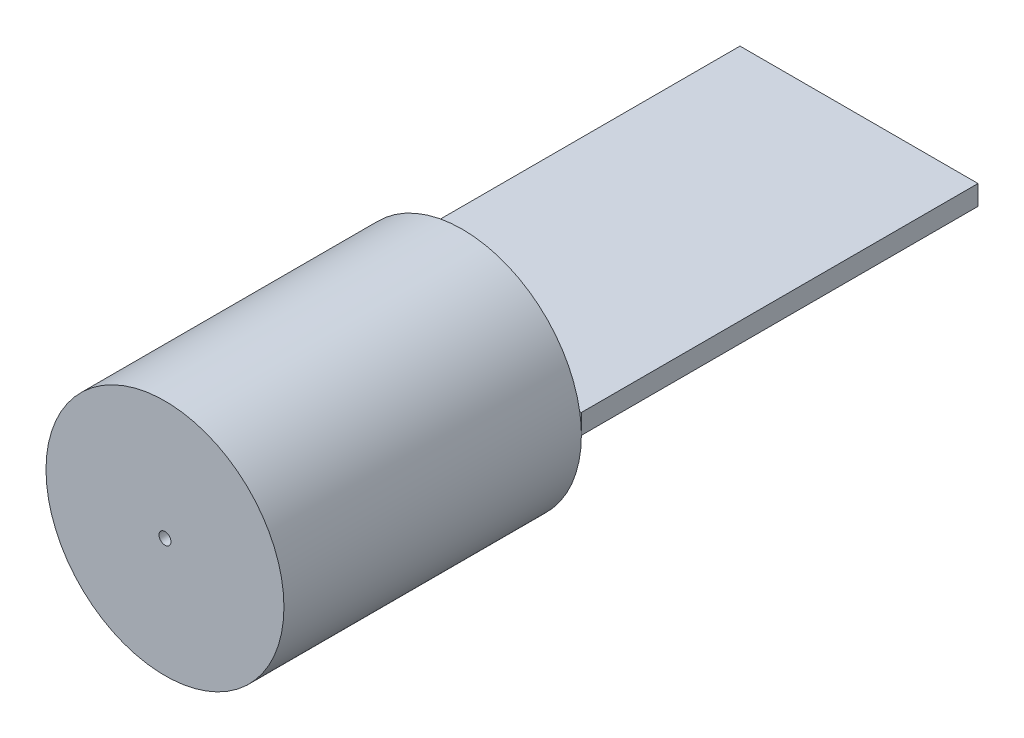
ISO-10303-21;
HEADER;
FILE_DESCRIPTION(('STEP AP214'),'2;1');
FILE_NAME('part.step','',(''),(''),'','','');
FILE_SCHEMA(('AUTOMOTIVE_DESIGN { 1 0 10303 214 1 1 1 1 }'));
ENDSEC;
DATA;
#1=APPLICATION_CONTEXT('core data for automotive mechanical design processes');
#2=APPLICATION_PROTOCOL_DEFINITION('international standard','automotive_design',2000,#1);
#3=PRODUCT_CONTEXT('',#1,'mechanical');
#4=PRODUCT('Part','Part','',(#3));
#5=PRODUCT_RELATED_PRODUCT_CATEGORY('part','',(#4));
#6=PRODUCT_DEFINITION_FORMATION('','',#4);
#7=PRODUCT_DEFINITION_CONTEXT('part definition',#1,'design');
#8=PRODUCT_DEFINITION('design','',#6,#7);
#9=PRODUCT_DEFINITION_SHAPE('','',#8);
#10=(LENGTH_UNIT() NAMED_UNIT(*) SI_UNIT(.MILLI.,.METRE.));
#11=(NAMED_UNIT(*) PLANE_ANGLE_UNIT() SI_UNIT($,.RADIAN.));
#12=(NAMED_UNIT(*) SI_UNIT($,.STERADIAN.) SOLID_ANGLE_UNIT());
#13=UNCERTAINTY_MEASURE_WITH_UNIT(LENGTH_MEASURE(1.E-05),#10,'distance_accuracy_value','');
#14=(GEOMETRIC_REPRESENTATION_CONTEXT(3) GLOBAL_UNCERTAINTY_ASSIGNED_CONTEXT((#13)) GLOBAL_UNIT_ASSIGNED_CONTEXT((#10,
#11,#12)) REPRESENTATION_CONTEXT('',''));
#15=CARTESIAN_POINT('',(0.,0.,0.));
#16=DIRECTION('',(0.,0.,1.));
#17=DIRECTION('',(1.,0.,0.));
#18=AXIS2_PLACEMENT_3D('',#15,#16,#17);
#19=CARTESIAN_POINT('',(0.,0.,0.));
#20=DIRECTION('',(0.,0.,1.));
#21=DIRECTION('',(1.,0.,0.));
#22=AXIS2_PLACEMENT_3D('',#19,#20,#21);
#23=PLANE('',#22);
#24=DIRECTION('',(1.,0.,0.));
#25=VECTOR('',#24,1.);
#26=CARTESIAN_POINT('',(-6.,1.,0.));
#27=LINE('',#26,#25);
#28=CARTESIAN_POINT('',(-5.91607978309962,1.,0.));
#29=VERTEX_POINT('',#28);
#30=CARTESIAN_POINT('',(5.91607978309962,1.,0.));
#31=VERTEX_POINT('',#30);
#32=EDGE_CURVE('E11',#29,#31,#27,.T.);
#33=ORIENTED_EDGE('',*,*,#32,.F.);
#34=CARTESIAN_POINT('',(0.,0.,0.));
#35=DIRECTION('',(0.,0.,1.));
#36=DIRECTION('',(1.,0.,0.));
#37=AXIS2_PLACEMENT_3D('',#34,#35,#36);
#38=CIRCLE('',#37,6.);
#39=EDGE_CURVE('E138',#31,#29,#38,.T.);
#40=ORIENTED_EDGE('',*,*,#39,.F.);
#41=EDGE_LOOP('',(#33,#40));
#42=FACE_BOUND('',#41,.T.);
#43=ADVANCED_FACE('F39',(#42),#23,.F.);
#44=CARTESIAN_POINT('',(0.,0.,15.));
#45=DIRECTION('',(0.,0.,-1.));
#46=DIRECTION('',(-1.,0.,0.));
#47=AXIS2_PLACEMENT_3D('',#44,#45,#46);
#48=CYLINDRICAL_SURFACE('',#47,6.);
#49=CARTESIAN_POINT('',(0.,0.,15.));
#50=DIRECTION('',(0.,0.,1.));
#51=DIRECTION('',(1.,0.,0.));
#52=AXIS2_PLACEMENT_3D('',#49,#50,#51);
#53=CIRCLE('',#52,6.);
#54=CARTESIAN_POINT('',(6.,0.,15.));
#55=VERTEX_POINT('',#54);
#56=EDGE_CURVE('E49',#55,#55,#53,.T.);
#57=ORIENTED_EDGE('',*,*,#56,.F.);
#58=EDGE_LOOP('',(#57));
#59=FACE_BOUND('',#58,.T.);
#60=CARTESIAN_POINT('',(6.,0.,0.));
#61=VERTEX_POINT('',#60);
#62=EDGE_CURVE('E43',#61,#31,#38,.T.);
#63=ORIENTED_EDGE('',*,*,#62,.T.);
#64=ORIENTED_EDGE('',*,*,#39,.T.);
#65=CARTESIAN_POINT('',(-6.,0.,0.));
#66=VERTEX_POINT('',#65);
#67=EDGE_CURVE('E99',#29,#66,#38,.T.);
#68=ORIENTED_EDGE('',*,*,#67,.T.);
#69=EDGE_CURVE('E58',#66,#61,#38,.T.);
#70=ORIENTED_EDGE('',*,*,#69,.T.);
#71=EDGE_LOOP('',(#63,#64,#68,#70));
#72=FACE_BOUND('',#71,.T.);
#73=ADVANCED_FACE('F41',(#59,#72),#48,.T.);
#74=CARTESIAN_POINT('',(0.,0.,15.));
#75=DIRECTION('',(0.,0.,1.));
#76=DIRECTION('',(1.,0.,0.));
#77=AXIS2_PLACEMENT_3D('',#74,#75,#76);
#78=PLANE('',#77);
#79=CARTESIAN_POINT('',(0.,0.,15.));
#80=DIRECTION('',(0.,0.,1.));
#81=DIRECTION('',(1.,0.,0.));
#82=AXIS2_PLACEMENT_3D('',#79,#80,#81);
#83=CIRCLE('',#82,0.3);
#84=CARTESIAN_POINT('',(0.3,0.,15.));
#85=VERTEX_POINT('',#84);
#86=EDGE_CURVE('E118',#85,#85,#83,.T.);
#87=ORIENTED_EDGE('',*,*,#86,.F.);
#88=EDGE_LOOP('',(#87));
#89=FACE_BOUND('',#88,.T.);
#90=ORIENTED_EDGE('',*,*,#56,.T.);
#91=EDGE_LOOP('',(#90));
#92=FACE_BOUND('',#91,.T.);
#93=ADVANCED_FACE('F199',(#89,#92),#78,.T.);
#94=ORIENTED_EDGE('',*,*,#69,.F.);
#95=DIRECTION('',(1.,0.,0.));
#96=VECTOR('',#95,1.);
#97=CARTESIAN_POINT('',(-6.,0.,0.));
#98=LINE('',#97,#96);
#99=EDGE_CURVE('E147',#66,#61,#98,.T.);
#100=ORIENTED_EDGE('',*,*,#99,.T.);
#101=EDGE_LOOP('',(#94,#100));
#102=FACE_BOUND('',#101,.T.);
#103=ADVANCED_FACE('F195',(#102),#23,.F.);
#104=CARTESIAN_POINT('',(0.,0.,12.));
#105=DIRECTION('',(0.,0.,1.));
#106=DIRECTION('',(1.,0.,0.));
#107=AXIS2_PLACEMENT_3D('',#104,#105,#106);
#108=CYLINDRICAL_SURFACE('',#107,0.3);
#109=CARTESIAN_POINT('',(0.,0.,12.));
#110=DIRECTION('',(0.,0.,1.));
#111=DIRECTION('',(1.,0.,0.));
#112=AXIS2_PLACEMENT_3D('',#109,#110,#111);
#113=CIRCLE('',#112,0.3);
#114=CARTESIAN_POINT('',(0.3,0.,12.));
#115=VERTEX_POINT('',#114);
#116=EDGE_CURVE('E124',#115,#115,#113,.T.);
#117=ORIENTED_EDGE('',*,*,#116,.F.);
#118=EDGE_LOOP('',(#117));
#119=FACE_BOUND('',#118,.T.);
#120=ORIENTED_EDGE('',*,*,#86,.T.);
#121=EDGE_LOOP('',(#120));
#122=FACE_BOUND('',#121,.T.);
#123=ADVANCED_FACE('F189',(#119,#122),#108,.F.);
#124=CARTESIAN_POINT('',(0.,0.,12.));
#125=DIRECTION('',(0.,0.,1.));
#126=DIRECTION('',(1.,0.,0.));
#127=AXIS2_PLACEMENT_3D('',#124,#125,#126);
#128=PLANE('',#127);
#129=ORIENTED_EDGE('',*,*,#116,.T.);
#130=EDGE_LOOP('',(#129));
#131=FACE_BOUND('',#130,.T.);
#132=ADVANCED_FACE('F182',(#131),#128,.T.);
#133=CARTESIAN_POINT('',(-6.,1.,0.));
#134=DIRECTION('',(0.,0.,-1.));
#135=DIRECTION('',(-1.,0.,0.));
#136=AXIS2_PLACEMENT_3D('',#133,#134,#135);
#137=PLANE('',#136);
#138=ORIENTED_EDGE('',*,*,#62,.F.);
#139=CARTESIAN_POINT('',(6.00333648647222,0.,0.));
#140=VERTEX_POINT('',#139);
#141=EDGE_CURVE('E151',#61,#140,#98,.T.);
#142=ORIENTED_EDGE('',*,*,#141,.T.);
#143=DIRECTION('',(0.,-1.,0.));
#144=VECTOR('',#143,1.);
#145=CARTESIAN_POINT('',(6.00333648647222,1.,0.));
#146=LINE('',#145,#144);
#147=CARTESIAN_POINT('',(6.00333648647222,1.,0.));
#148=VERTEX_POINT('',#147);
#149=EDGE_CURVE('E119',#148,#140,#146,.T.);
#150=ORIENTED_EDGE('',*,*,#149,.F.);
#151=EDGE_CURVE('E52',#31,#148,#27,.T.);
#152=ORIENTED_EDGE('',*,*,#151,.F.);
#153=EDGE_LOOP('',(#138,#142,#150,#152));
#154=FACE_BOUND('',#153,.T.);
#155=ADVANCED_FACE('F176',(#154),#137,.F.);
#156=CARTESIAN_POINT('',(-6.,1.,0.));
#157=DIRECTION('',(1.,0.,0.));
#158=DIRECTION('',(0.,0.,-1.));
#159=AXIS2_PLACEMENT_3D('',#156,#157,#158);
#160=PLANE('',#159);
#161=DIRECTION('',(0.,0.,1.));
#162=VECTOR('',#161,1.);
#163=CARTESIAN_POINT('',(-6.,0.,0.));
#164=LINE('',#163,#162);
#165=CARTESIAN_POINT('',(-6.,0.,-20.));
#166=VERTEX_POINT('',#165);
#167=EDGE_CURVE('E116',#166,#66,#164,.T.);
#168=ORIENTED_EDGE('',*,*,#167,.T.);
#169=DIRECTION('',(0.,-1.,0.));
#170=VECTOR('',#169,1.);
#171=CARTESIAN_POINT('',(-6.,1.,0.));
#172=LINE('',#171,#170);
#173=CARTESIAN_POINT('',(-6.,1.,0.));
#174=VERTEX_POINT('',#173);
#175=EDGE_CURVE('E97',#174,#66,#172,.T.);
#176=ORIENTED_EDGE('',*,*,#175,.F.);
#177=DIRECTION('',(0.,0.,1.));
#178=VECTOR('',#177,1.);
#179=CARTESIAN_POINT('',(-6.,1.,0.));
#180=LINE('',#179,#178);
#181=CARTESIAN_POINT('',(-6.,1.,-20.));
#182=VERTEX_POINT('',#181);
#183=EDGE_CURVE('E104',#182,#174,#180,.T.);
#184=ORIENTED_EDGE('',*,*,#183,.F.);
#185=DIRECTION('',(0.,-1.,0.));
#186=VECTOR('',#185,1.);
#187=CARTESIAN_POINT('',(-6.,1.,-20.));
#188=LINE('',#187,#186);
#189=EDGE_CURVE('E163',#182,#166,#188,.T.);
#190=ORIENTED_EDGE('',*,*,#189,.T.);
#191=EDGE_LOOP('',(#168,#176,#184,#190));
#192=FACE_BOUND('',#191,.T.);
#193=ADVANCED_FACE('F114',(#192),#160,.F.);
#194=ORIENTED_EDGE('',*,*,#67,.F.);
#195=EDGE_CURVE('E51',#174,#29,#27,.T.);
#196=ORIENTED_EDGE('',*,*,#195,.F.);
#197=ORIENTED_EDGE('',*,*,#175,.T.);
#198=EDGE_LOOP('',(#194,#196,#197));
#199=FACE_BOUND('',#198,.T.);
#200=ADVANCED_FACE('F95',(#199),#137,.F.);
#201=CARTESIAN_POINT('',(6.00333648647222,1.,0.));
#202=DIRECTION('',(-1.,0.,0.));
#203=DIRECTION('',(0.,0.,1.));
#204=AXIS2_PLACEMENT_3D('',#201,#202,#203);
#205=PLANE('',#204);
#206=DIRECTION('',(0.,0.,-1.));
#207=VECTOR('',#206,1.);
#208=CARTESIAN_POINT('',(6.00333648647222,0.,0.));
#209=LINE('',#208,#207);
#210=CARTESIAN_POINT('',(6.00333648647222,0.,-20.));
#211=VERTEX_POINT('',#210);
#212=EDGE_CURVE('E153',#140,#211,#209,.T.);
#213=ORIENTED_EDGE('',*,*,#212,.T.);
#214=DIRECTION('',(0.,-1.,0.));
#215=VECTOR('',#214,1.);
#216=CARTESIAN_POINT('',(6.00333648647222,1.,-20.));
#217=LINE('',#216,#215);
#218=CARTESIAN_POINT('',(6.00333648647222,1.,-20.));
#219=VERTEX_POINT('',#218);
#220=EDGE_CURVE('E127',#219,#211,#217,.T.);
#221=ORIENTED_EDGE('',*,*,#220,.F.);
#222=DIRECTION('',(0.,0.,-1.));
#223=VECTOR('',#222,1.);
#224=CARTESIAN_POINT('',(6.00333648647222,1.,0.));
#225=LINE('',#224,#223);
#226=EDGE_CURVE('E102',#148,#219,#225,.T.);
#227=ORIENTED_EDGE('',*,*,#226,.F.);
#228=ORIENTED_EDGE('',*,*,#149,.T.);
#229=EDGE_LOOP('',(#213,#221,#227,#228));
#230=FACE_BOUND('',#229,.T.);
#231=ADVANCED_FACE('F172',(#230),#205,.F.);
#232=CARTESIAN_POINT('',(-6.,1.,-20.));
#233=DIRECTION('',(0.,0.,1.));
#234=DIRECTION('',(1.,0.,0.));
#235=AXIS2_PLACEMENT_3D('',#232,#233,#234);
#236=PLANE('',#235);
#237=DIRECTION('',(-1.,0.,0.));
#238=VECTOR('',#237,1.);
#239=CARTESIAN_POINT('',(-6.,0.,-20.));
#240=LINE('',#239,#238);
#241=EDGE_CURVE('E112',#211,#166,#240,.T.);
#242=ORIENTED_EDGE('',*,*,#241,.T.);
#243=ORIENTED_EDGE('',*,*,#189,.F.);
#244=DIRECTION('',(-1.,0.,0.));
#245=VECTOR('',#244,1.);
#246=CARTESIAN_POINT('',(-6.,1.,-20.));
#247=LINE('',#246,#245);
#248=EDGE_CURVE('E107',#219,#182,#247,.T.);
#249=ORIENTED_EDGE('',*,*,#248,.F.);
#250=ORIENTED_EDGE('',*,*,#220,.T.);
#251=EDGE_LOOP('',(#242,#243,#249,#250));
#252=FACE_BOUND('',#251,.T.);
#253=ADVANCED_FACE('F169',(#252),#236,.F.);
#254=CARTESIAN_POINT('',(0.,1.,0.));
#255=DIRECTION('',(0.,-1.,0.));
#256=DIRECTION('',(0.,0.,-1.));
#257=AXIS2_PLACEMENT_3D('',#254,#255,#256);
#258=PLANE('',#257);
#259=ORIENTED_EDGE('',*,*,#183,.T.);
#260=ORIENTED_EDGE('',*,*,#195,.T.);
#261=ORIENTED_EDGE('',*,*,#32,.T.);
#262=ORIENTED_EDGE('',*,*,#151,.T.);
#263=ORIENTED_EDGE('',*,*,#226,.T.);
#264=ORIENTED_EDGE('',*,*,#248,.T.);
#265=EDGE_LOOP('',(#259,#260,#261,#262,#263,#264));
#266=FACE_BOUND('',#265,.T.);
#267=ADVANCED_FACE('F105',(#266),#258,.F.);
#268=CARTESIAN_POINT('',(0.,0.,0.));
#269=DIRECTION('',(0.,-1.,0.));
#270=DIRECTION('',(0.,0.,-1.));
#271=AXIS2_PLACEMENT_3D('',#268,#269,#270);
#272=PLANE('',#271);
#273=ORIENTED_EDGE('',*,*,#167,.F.);
#274=ORIENTED_EDGE('',*,*,#241,.F.);
#275=ORIENTED_EDGE('',*,*,#212,.F.);
#276=ORIENTED_EDGE('',*,*,#141,.F.);
#277=ORIENTED_EDGE('',*,*,#99,.F.);
#278=EDGE_LOOP('',(#273,#274,#275,#276,#277));
#279=FACE_BOUND('',#278,.T.);
#280=ADVANCED_FACE('F148',(#279),#272,.T.);
#281=CLOSED_SHELL('',(#43,#73,#93,#103,#123,#132,#155,#193,#200,#231,#253,#267,#280));
#282=MANIFOLD_SOLID_BREP('B2',#281);
#283=ADVANCED_BREP_SHAPE_REPRESENTATION('',(#18,#282),#14);
#284=SHAPE_DEFINITION_REPRESENTATION(#9,#283);
ENDSEC;
END-ISO-10303-21;
